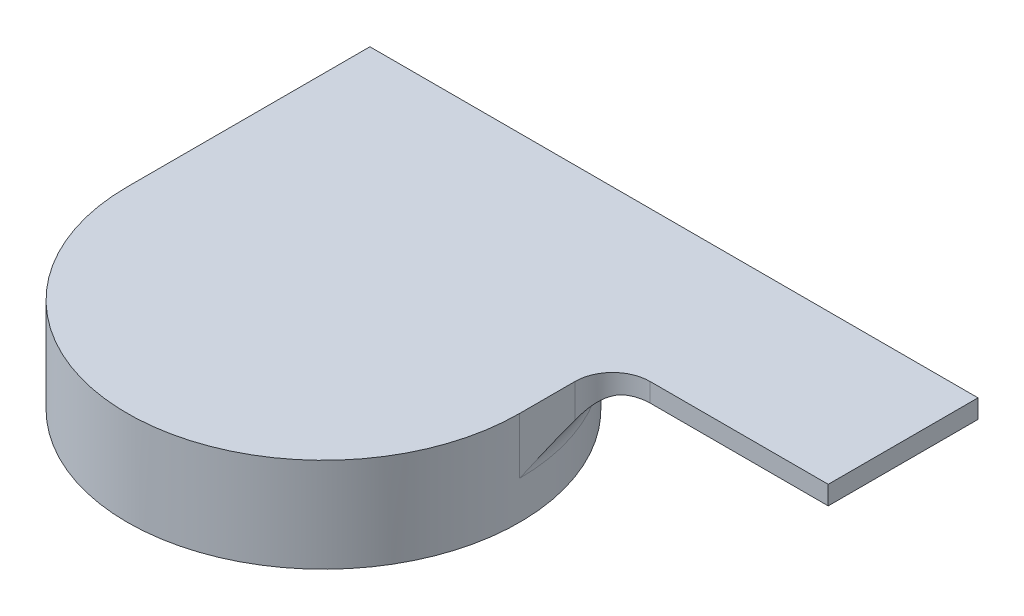
ISO-10303-21;
HEADER;
FILE_DESCRIPTION(('STEP AP214'),'2;1');
FILE_NAME('part.step','',(''),(''),'','','');
FILE_SCHEMA(('AUTOMOTIVE_DESIGN { 1 0 10303 214 1 1 1 1 }'));
ENDSEC;
DATA;
#1=APPLICATION_CONTEXT('core data for automotive mechanical design processes');
#2=APPLICATION_PROTOCOL_DEFINITION('international standard','automotive_design',2000,#1);
#3=PRODUCT_CONTEXT('',#1,'mechanical');
#4=PRODUCT('Part','Part','',(#3));
#5=PRODUCT_RELATED_PRODUCT_CATEGORY('part','',(#4));
#6=PRODUCT_DEFINITION_FORMATION('','',#4);
#7=PRODUCT_DEFINITION_CONTEXT('part definition',#1,'design');
#8=PRODUCT_DEFINITION('design','',#6,#7);
#9=PRODUCT_DEFINITION_SHAPE('','',#8);
#10=(LENGTH_UNIT() NAMED_UNIT(*) SI_UNIT(.MILLI.,.METRE.));
#11=(NAMED_UNIT(*) PLANE_ANGLE_UNIT() SI_UNIT($,.RADIAN.));
#12=(NAMED_UNIT(*) SI_UNIT($,.STERADIAN.) SOLID_ANGLE_UNIT());
#13=UNCERTAINTY_MEASURE_WITH_UNIT(LENGTH_MEASURE(1.E-05),#10,'distance_accuracy_value','');
#14=(GEOMETRIC_REPRESENTATION_CONTEXT(3) GLOBAL_UNCERTAINTY_ASSIGNED_CONTEXT((#13)) GLOBAL_UNIT_ASSIGNED_CONTEXT((#10,
#11,#12)) REPRESENTATION_CONTEXT('',''));
#15=CARTESIAN_POINT('',(0.,0.,0.));
#16=DIRECTION('',(0.,0.,1.));
#17=DIRECTION('',(1.,0.,0.));
#18=AXIS2_PLACEMENT_3D('',#15,#16,#17);
#19=CARTESIAN_POINT('',(0.,16.002,0.));
#20=DIRECTION('',(0.,-1.,0.));
#21=DIRECTION('',(0.,0.,-1.));
#22=AXIS2_PLACEMENT_3D('',#19,#20,#21);
#23=CYLINDRICAL_SURFACE('',#22,33.274);
#24=DIRECTION('',(0.,1.,0.));
#25=VECTOR('',#24,1.);
#26=CARTESIAN_POINT('',(-33.274,12.827,0.));
#27=LINE('',#26,#25);
#28=CARTESIAN_POINT('',(-33.274,6.477,0.));
#29=VERTEX_POINT('',#28);
#30=CARTESIAN_POINT('',(-33.274,16.002,0.));
#31=VERTEX_POINT('',#30);
#32=EDGE_CURVE('E140',#29,#31,#27,.T.);
#33=ORIENTED_EDGE('',*,*,#32,.F.);
#34=CARTESIAN_POINT('',(0.,6.477,0.));
#35=DIRECTION('',(0.,1.,0.));
#36=DIRECTION('',(0.,0.,1.));
#37=AXIS2_PLACEMENT_3D('',#34,#35,#36);
#38=CIRCLE('',#37,33.274);
#39=CARTESIAN_POINT('',(33.274,6.477,0.));
#40=VERTEX_POINT('',#39);
#41=EDGE_CURVE('E155',#29,#40,#38,.F.);
#42=ORIENTED_EDGE('',*,*,#41,.T.);
#43=DIRECTION('',(0.,1.,0.));
#44=VECTOR('',#43,1.);
#45=CARTESIAN_POINT('',(33.274,12.827,0.));
#46=LINE('',#45,#44);
#47=CARTESIAN_POINT('',(33.274,16.002,0.));
#48=VERTEX_POINT('',#47);
#49=EDGE_CURVE('E117',#40,#48,#46,.T.);
#50=ORIENTED_EDGE('',*,*,#49,.T.);
#51=CARTESIAN_POINT('',(0.,16.002,0.));
#52=DIRECTION('',(0.,1.,0.));
#53=DIRECTION('',(0.,0.,1.));
#54=AXIS2_PLACEMENT_3D('',#51,#52,#53);
#55=CIRCLE('',#54,33.274);
#56=EDGE_CURVE('E149',#31,#48,#55,.T.);
#57=ORIENTED_EDGE('',*,*,#56,.F.);
#58=EDGE_LOOP('',(#33,#42,#50,#57));
#59=FACE_BOUND('',#58,.T.);
#60=CARTESIAN_POINT('',(0.,0.,0.));
#61=DIRECTION('',(0.,1.,0.));
#62=DIRECTION('',(0.,0.,1.));
#63=AXIS2_PLACEMENT_3D('',#60,#61,#62);
#64=CIRCLE('',#63,33.274);
#65=CARTESIAN_POINT('',(0.,0.,33.274));
#66=VERTEX_POINT('',#65);
#67=EDGE_CURVE('E143',#66,#66,#64,.T.);
#68=ORIENTED_EDGE('',*,*,#67,.T.);
#69=EDGE_LOOP('',(#68));
#70=FACE_BOUND('',#69,.T.);
#71=ADVANCED_FACE('F33',(#59,#70),#23,.T.);
#72=CARTESIAN_POINT('',(0.,16.002,0.));
#73=DIRECTION('',(0.,1.,0.));
#74=DIRECTION('',(0.,0.,1.));
#75=AXIS2_PLACEMENT_3D('',#72,#73,#74);
#76=PLANE('',#75);
#77=ORIENTED_EDGE('',*,*,#56,.T.);
#78=DIRECTION('',(0.,0.,-1.));
#79=VECTOR('',#78,1.);
#80=CARTESIAN_POINT('',(33.274,16.002,0.));
#81=LINE('',#80,#79);
#82=CARTESIAN_POINT('',(33.274,16.002,-9.398));
#83=VERTEX_POINT('',#82);
#84=EDGE_CURVE('E130',#48,#83,#81,.T.);
#85=ORIENTED_EDGE('',*,*,#84,.T.);
#86=CARTESIAN_POINT('',(39.624,16.002,-9.398));
#87=DIRECTION('',(0.,1.,0.));
#88=DIRECTION('',(0.,0.,1.));
#89=AXIS2_PLACEMENT_3D('',#86,#87,#88);
#90=CIRCLE('',#89,6.35);
#91=CARTESIAN_POINT('',(39.624,16.002,-15.748));
#92=VERTEX_POINT('',#91);
#93=EDGE_CURVE('E214',#83,#92,#90,.F.);
#94=ORIENTED_EDGE('',*,*,#93,.T.);
#95=DIRECTION('',(1.,0.,0.));
#96=VECTOR('',#95,1.);
#97=CARTESIAN_POINT('',(33.274,16.002,-15.748));
#98=LINE('',#97,#96);
#99=CARTESIAN_POINT('',(69.85,16.002,-15.748));
#100=VERTEX_POINT('',#99);
#101=EDGE_CURVE('E133',#92,#100,#98,.T.);
#102=ORIENTED_EDGE('',*,*,#101,.T.);
#103=DIRECTION('',(0.,0.,-1.));
#104=VECTOR('',#103,1.);
#105=CARTESIAN_POINT('',(69.85,16.002,-41.148));
#106=LINE('',#105,#104);
#107=CARTESIAN_POINT('',(69.85,16.002,-41.148));
#108=VERTEX_POINT('',#107);
#109=EDGE_CURVE('E115',#100,#108,#106,.T.);
#110=ORIENTED_EDGE('',*,*,#109,.T.);
#111=DIRECTION('',(-1.,0.,0.));
#112=VECTOR('',#111,1.);
#113=CARTESIAN_POINT('',(-33.274,16.002,-41.148));
#114=LINE('',#113,#112);
#115=CARTESIAN_POINT('',(-33.274,16.002,-41.148));
#116=VERTEX_POINT('',#115);
#117=EDGE_CURVE('E136',#108,#116,#114,.T.);
#118=ORIENTED_EDGE('',*,*,#117,.T.);
#119=DIRECTION('',(0.,0.,1.));
#120=VECTOR('',#119,1.);
#121=CARTESIAN_POINT('',(-33.274,16.002,0.));
#122=LINE('',#121,#120);
#123=EDGE_CURVE('E109',#116,#31,#122,.T.);
#124=ORIENTED_EDGE('',*,*,#123,.T.);
#125=EDGE_LOOP('',(#77,#85,#94,#102,#110,#118,#124));
#126=FACE_BOUND('',#125,.T.);
#127=ADVANCED_FACE('F192',(#126),#76,.T.);
#128=CARTESIAN_POINT('',(0.,0.,0.));
#129=DIRECTION('',(0.,1.,0.));
#130=DIRECTION('',(0.,0.,1.));
#131=AXIS2_PLACEMENT_3D('',#128,#129,#130);
#132=PLANE('',#131);
#133=ORIENTED_EDGE('',*,*,#67,.F.);
#134=EDGE_LOOP('',(#133));
#135=FACE_BOUND('',#134,.T.);
#136=ADVANCED_FACE('F195',(#135),#132,.F.);
#137=CARTESIAN_POINT('',(0.,12.827,0.));
#138=DIRECTION('',(0.,1.,0.));
#139=DIRECTION('',(0.,0.,1.));
#140=AXIS2_PLACEMENT_3D('',#137,#138,#139);
#141=PLANE('',#140);
#142=DIRECTION('',(1.,0.,0.));
#143=VECTOR('',#142,1.);
#144=CARTESIAN_POINT('',(33.274,12.827,-15.748));
#145=LINE('',#144,#143);
#146=CARTESIAN_POINT('',(39.624,12.827,-15.748));
#147=VERTEX_POINT('',#146);
#148=CARTESIAN_POINT('',(69.85,12.827,-15.748));
#149=VERTEX_POINT('',#148);
#150=EDGE_CURVE('E100',#147,#149,#145,.T.);
#151=ORIENTED_EDGE('',*,*,#150,.F.);
#152=CARTESIAN_POINT('',(39.624,12.827,-9.398));
#153=DIRECTION('',(0.,1.,0.));
#154=DIRECTION('',(0.,0.,1.));
#155=AXIS2_PLACEMENT_3D('',#152,#153,#154);
#156=CIRCLE('',#155,6.35);
#157=CARTESIAN_POINT('',(36.6677575554039,12.827,-15.0178870637023));
#158=VERTEX_POINT('',#157);
#159=EDGE_CURVE('E45',#147,#158,#156,.T.);
#160=ORIENTED_EDGE('',*,*,#159,.T.);
#161=CARTESIAN_POINT('',(0.,12.827,0.));
#162=DIRECTION('',(0.,1.,0.));
#163=DIRECTION('',(0.,0.,1.));
#164=AXIS2_PLACEMENT_3D('',#161,#162,#163);
#165=CIRCLE('',#164,39.624);
#166=CARTESIAN_POINT('',(-33.274,12.827,-21.5151644195437));
#167=VERTEX_POINT('',#166);
#168=EDGE_CURVE('E51',#158,#167,#165,.T.);
#169=ORIENTED_EDGE('',*,*,#168,.T.);
#170=DIRECTION('',(0.,0.,1.));
#171=VECTOR('',#170,1.);
#172=CARTESIAN_POINT('',(-33.274,12.827,0.));
#173=LINE('',#172,#171);
#174=CARTESIAN_POINT('',(-33.274,12.827,-41.148));
#175=VERTEX_POINT('',#174);
#176=EDGE_CURVE('E125',#175,#167,#173,.T.);
#177=ORIENTED_EDGE('',*,*,#176,.F.);
#178=DIRECTION('',(-1.,0.,0.));
#179=VECTOR('',#178,1.);
#180=CARTESIAN_POINT('',(-33.274,12.827,-41.148));
#181=LINE('',#180,#179);
#182=CARTESIAN_POINT('',(69.85,12.827,-41.148));
#183=VERTEX_POINT('',#182);
#184=EDGE_CURVE('E123',#183,#175,#181,.T.);
#185=ORIENTED_EDGE('',*,*,#184,.F.);
#186=DIRECTION('',(0.,0.,-1.));
#187=VECTOR('',#186,1.);
#188=CARTESIAN_POINT('',(69.85,12.827,-41.148));
#189=LINE('',#188,#187);
#190=EDGE_CURVE('E108',#149,#183,#189,.T.);
#191=ORIENTED_EDGE('',*,*,#190,.F.);
#192=EDGE_LOOP('',(#151,#160,#169,#177,#185,#191));
#193=FACE_BOUND('',#192,.T.);
#194=ADVANCED_FACE('F120',(#193),#141,.F.);
#195=CARTESIAN_POINT('',(-33.274,12.827,0.));
#196=DIRECTION('',(-1.,0.,0.));
#197=DIRECTION('',(0.,0.,1.));
#198=AXIS2_PLACEMENT_3D('',#195,#196,#197);
#199=PLANE('',#198);
#200=ORIENTED_EDGE('',*,*,#123,.F.);
#201=DIRECTION('',(0.,1.,0.));
#202=VECTOR('',#201,1.);
#203=CARTESIAN_POINT('',(-33.274,12.827,-41.148));
#204=LINE('',#203,#202);
#205=EDGE_CURVE('E144',#175,#116,#204,.T.);
#206=ORIENTED_EDGE('',*,*,#205,.F.);
#207=ORIENTED_EDGE('',*,*,#176,.T.);
#208=CARTESIAN_POINT('',(-33.274,12.827,-21.5151644195437));
#209=CARTESIAN_POINT('',(-33.274,12.8269965383206,-21.3128395480441));
#210=CARTESIAN_POINT('',(-33.274,12.824149426921,-21.1105305347367));
#211=CARTESIAN_POINT('',(-33.274,12.813081509395,-20.7060780321664));
#212=CARTESIAN_POINT('',(-33.274,12.8048612301874,-20.5039345286188));
#213=CARTESIAN_POINT('',(-33.274,12.7726235237426,-19.8981462048356));
#214=CARTESIAN_POINT('',(-33.274,12.7410284354839,-19.4948901516963));
#215=CARTESIAN_POINT('',(-33.274,12.6599715365119,-18.6913745773575));
#216=CARTESIAN_POINT('',(-33.274,12.6105603458468,-18.2911098134066));
#217=CARTESIAN_POINT('',(-33.274,12.4957872260963,-17.4928362429079));
#218=CARTESIAN_POINT('',(-33.274,12.4304227053888,-17.0948278136621));
#219=CARTESIAN_POINT('',(-33.274,12.2146031851565,-15.9132882842229));
#220=CARTESIAN_POINT('',(-33.274,12.0434609162049,-15.1335067059455));
#221=CARTESIAN_POINT('',(-33.274,11.6569575323403,-13.5845777833042));
#222=CARTESIAN_POINT('',(-33.274,11.4415598860232,-12.8154397883368));
#223=CARTESIAN_POINT('',(-33.274,11.0520510132461,-11.5374371040148));
#224=CARTESIAN_POINT('',(-33.274,10.8874416064445,-11.0256336409714));
#225=CARTESIAN_POINT('',(-33.274,10.5449207871129,-10.0064888526166));
#226=CARTESIAN_POINT('',(-33.274,10.3670088798328,-9.49914769405351));
#227=CARTESIAN_POINT('',(-33.274,9.81683831022568,-7.98331243767083));
#228=CARTESIAN_POINT('',(-33.274,9.42808619703558,-6.98082018187442));
#229=CARTESIAN_POINT('',(-33.274,8.62164040635768,-4.98454850114973));
#230=CARTESIAN_POINT('',(-33.274,8.20386978600365,-3.99080077378213));
#231=CARTESIAN_POINT('',(-33.274,7.35462349949581,-2.00916608349406));
#232=CARTESIAN_POINT('',(-33.274,6.92314705692049,-1.02127945637485));
#233=CARTESIAN_POINT('',(-33.274,6.4867364108287,-0.0222876653168525));
#234=CARTESIAN_POINT('',(-33.274,6.481868204751,-0.0111438322937059));
#235=CARTESIAN_POINT('',(-33.274,6.477,0.));
#236=B_SPLINE_CURVE_WITH_KNOTS('',3,(#208,#209,#210,#211,#212,#213,#214,#215,#216,#217,#218,
#219,#220,#221,#222,#223,#224,#225,#226,#227,#228,#229,#230,#231,#232,#233,#234,#235),
.UNSPECIFIED.,.F.,.F.,(4,2,2,2,2,2,2,2,2,2,2,2,2,4),(0.,0.606927972168669,1.2137964349722,
2.4267740144667,3.63633203008669,4.84608666961027,7.23929525970568,9.63448736199307,
11.2471682841813,12.8599092154738,16.0848055494803,19.3186056672016,22.5525893044123,
22.5890716288992),.UNSPECIFIED.);
#237=EDGE_CURVE('E158',#167,#29,#236,.T.);
#238=ORIENTED_EDGE('',*,*,#237,.T.);
#239=ORIENTED_EDGE('',*,*,#32,.T.);
#240=EDGE_LOOP('',(#200,#206,#207,#238,#239));
#241=FACE_BOUND('',#240,.T.);
#242=ADVANCED_FACE('F174',(#241),#199,.T.);
#243=CARTESIAN_POINT('',(-33.274,12.827,-41.148));
#244=DIRECTION('',(0.,0.,-1.));
#245=DIRECTION('',(-1.,0.,0.));
#246=AXIS2_PLACEMENT_3D('',#243,#244,#245);
#247=PLANE('',#246);
#248=ORIENTED_EDGE('',*,*,#117,.F.);
#249=DIRECTION('',(0.,1.,0.));
#250=VECTOR('',#249,1.);
#251=CARTESIAN_POINT('',(69.85,12.827,-41.148));
#252=LINE('',#251,#250);
#253=EDGE_CURVE('E116',#183,#108,#252,.T.);
#254=ORIENTED_EDGE('',*,*,#253,.F.);
#255=ORIENTED_EDGE('',*,*,#184,.T.);
#256=ORIENTED_EDGE('',*,*,#205,.T.);
#257=EDGE_LOOP('',(#248,#254,#255,#256));
#258=FACE_BOUND('',#257,.T.);
#259=ADVANCED_FACE('F179',(#258),#247,.T.);
#260=CARTESIAN_POINT('',(69.85,12.827,-41.148));
#261=DIRECTION('',(1.,0.,0.));
#262=DIRECTION('',(0.,0.,-1.));
#263=AXIS2_PLACEMENT_3D('',#260,#261,#262);
#264=PLANE('',#263);
#265=ORIENTED_EDGE('',*,*,#109,.F.);
#266=DIRECTION('',(0.,1.,0.));
#267=VECTOR('',#266,1.);
#268=CARTESIAN_POINT('',(69.85,12.827,-15.748));
#269=LINE('',#268,#267);
#270=EDGE_CURVE('E103',#149,#100,#269,.T.);
#271=ORIENTED_EDGE('',*,*,#270,.F.);
#272=ORIENTED_EDGE('',*,*,#190,.T.);
#273=ORIENTED_EDGE('',*,*,#253,.T.);
#274=EDGE_LOOP('',(#265,#271,#272,#273));
#275=FACE_BOUND('',#274,.T.);
#276=ADVANCED_FACE('F113',(#275),#264,.T.);
#277=CARTESIAN_POINT('',(33.274,12.827,-15.748));
#278=DIRECTION('',(0.,0.,1.));
#279=DIRECTION('',(1.,0.,0.));
#280=AXIS2_PLACEMENT_3D('',#277,#278,#279);
#281=PLANE('',#280);
#282=ORIENTED_EDGE('',*,*,#101,.F.);
#283=DIRECTION('',(0.,1.,0.));
#284=VECTOR('',#283,1.);
#285=CARTESIAN_POINT('',(39.624,12.1706673037467,-15.748));
#286=LINE('',#285,#284);
#287=EDGE_CURVE('E59',#92,#147,#286,.F.);
#288=ORIENTED_EDGE('',*,*,#287,.T.);
#289=ORIENTED_EDGE('',*,*,#150,.T.);
#290=ORIENTED_EDGE('',*,*,#270,.T.);
#291=EDGE_LOOP('',(#282,#288,#289,#290));
#292=FACE_BOUND('',#291,.T.);
#293=ADVANCED_FACE('F102',(#292),#281,.T.);
#294=CARTESIAN_POINT('',(33.274,12.827,0.));
#295=DIRECTION('',(1.,0.,0.));
#296=DIRECTION('',(0.,0.,-1.));
#297=AXIS2_PLACEMENT_3D('',#294,#295,#296);
#298=PLANE('',#297);
#299=CARTESIAN_POINT('',(33.274,12.1706673037467,-15.748));
#300=CARTESIAN_POINT('',(33.274,12.1153140404355,-15.485979458627));
#301=CARTESIAN_POINT('',(33.274,12.0571099631094,-15.224574941341));
#302=CARTESIAN_POINT('',(33.274,11.9354072419507,-14.7030194907815));
#303=CARTESIAN_POINT('',(33.274,11.8719089734915,-14.4428684700126));
#304=CARTESIAN_POINT('',(33.274,11.6741296870633,-13.6645034610109));
#305=CARTESIAN_POINT('',(33.274,11.5325141912068,-13.1481442606859));
#306=CARTESIAN_POINT('',(33.274,11.2329180504046,-12.1213203578225));
#307=CARTESIAN_POINT('',(33.274,11.0749694354563,-11.6108462212756));
#308=CARTESIAN_POINT('',(33.274,10.7450076873298,-10.5944195595574));
#309=CARTESIAN_POINT('',(33.274,10.5729928978195,-10.088467574686));
#310=CARTESIAN_POINT('',(33.274,10.0405376480277,-8.58012427114889));
#311=CARTESIAN_POINT('',(33.274,9.66267543484246,-7.58389418259669));
#312=CARTESIAN_POINT('',(33.274,8.87640602864826,-5.60323922410806));
#313=CARTESIAN_POINT('',(33.274,8.46798392168063,-4.61882039387053));
#314=CARTESIAN_POINT('',(33.274,7.53969703662096,-2.43287056554385));
#315=CARTESIAN_POINT('',(33.274,7.01568853941516,-1.23311668848449));
#316=CARTESIAN_POINT('',(33.274,6.48673640892137,-0.0222876643021202));
#317=CARTESIAN_POINT('',(33.274,6.48186820282284,-0.0111438312710996));
#318=CARTESIAN_POINT('',(33.274,6.477,0.));
#319=B_SPLINE_CURVE_WITH_KNOTS('',3,(#299,#300,#301,#302,#303,#304,#305,#306,#307,#308,#309,
#310,#311,#312,#313,#314,#315,#316,#317,#318),.UNSPECIFIED.,.F.,.F.,(4,2,2,2,2,2,2,2,2,4),(0.,
0.803372666568424,1.60668842008394,3.21260473462621,4.81542944076542,6.41844315660601,
9.61398082175581,12.8110882868985,16.7385772226782,16.7750595471655),.UNSPECIFIED.);
#320=CARTESIAN_POINT('',(33.274,10.3289507726057,-9.39799999999996));
#321=VERTEX_POINT('',#320);
#322=EDGE_CURVE('E165',#40,#321,#319,.F.);
#323=ORIENTED_EDGE('',*,*,#322,.T.);
#324=DIRECTION('',(0.,1.,0.));
#325=VECTOR('',#324,1.);
#326=CARTESIAN_POINT('',(33.274,16.002,-9.398));
#327=LINE('',#326,#325);
#328=EDGE_CURVE('E213',#321,#83,#327,.T.);
#329=ORIENTED_EDGE('',*,*,#328,.T.);
#330=ORIENTED_EDGE('',*,*,#84,.F.);
#331=ORIENTED_EDGE('',*,*,#49,.F.);
#332=EDGE_LOOP('',(#323,#329,#330,#331));
#333=FACE_BOUND('',#332,.T.);
#334=ADVANCED_FACE('F187',(#333),#298,.T.);
#335=CARTESIAN_POINT('',(0.,6.477,0.));
#336=DIRECTION('',(0.,1.,0.));
#337=DIRECTION('',(0.,0.,1.));
#338=AXIS2_PLACEMENT_3D('',#335,#336,#337);
#339=TOROIDAL_SURFACE('',#338,39.624,6.35);
#340=ORIENTED_EDGE('',*,*,#322,.F.);
#341=ORIENTED_EDGE('',*,*,#41,.F.);
#342=ORIENTED_EDGE('',*,*,#237,.F.);
#343=ORIENTED_EDGE('',*,*,#168,.F.);
#344=CARTESIAN_POINT('',(36.6677575554039,12.827,-15.0178870637023));
#345=CARTESIAN_POINT('',(36.5365638465923,12.8270416333298,-14.9489197302521));
#346=CARTESIAN_POINT('',(36.4078610233214,12.8218599495453,-14.875311695999));
#347=CARTESIAN_POINT('',(36.1565901878148,12.8015819652986,-14.7197704831126));
#348=CARTESIAN_POINT('',(36.0340156681752,12.7864964327813,-14.6378464277487));
#349=CARTESIAN_POINT('',(35.797144681767,12.7471530926799,-14.4673965692218));
#350=CARTESIAN_POINT('',(35.6827734214879,12.7229955789828,-14.3789511569404));
#351=CARTESIAN_POINT('',(35.4615327475671,12.6662280882566,-14.1956042728952));
#352=CARTESIAN_POINT('',(35.3546650006604,12.6336162407906,-14.1007013759084));
#353=CARTESIAN_POINT('',(35.1493828280165,12.5609445878783,-13.9057981124323));
#354=CARTESIAN_POINT('',(35.0509318642669,12.5209196439843,-13.8058231337806));
#355=CARTESIAN_POINT('',(34.8621481483267,12.4342169818604,-13.6011738378656));
#356=CARTESIAN_POINT('',(34.7718190286603,12.3875363107297,-13.4964974489556));
#357=CARTESIAN_POINT('',(34.512615465834,12.2385496330251,-13.1758185276639));
#358=CARTESIAN_POINT('',(34.3561012642306,12.1275124081832,-12.9537201850916));
#359=CARTESIAN_POINT('',(34.1130745719567,11.9215432975428,-12.5588230959998));
#360=CARTESIAN_POINT('',(34.0190185349345,11.8301923160749,-12.3886388698634));
#361=CARTESIAN_POINT('',(33.8477783165619,11.6418900596567,-12.0428038700446));
#362=CARTESIAN_POINT('',(33.7706032076387,11.5449358085162,-11.867150214535));
#363=CARTESIAN_POINT('',(33.6328512068634,11.3486154798805,-11.5110697564454));
#364=CARTESIAN_POINT('',(33.5722566321886,11.24925209581,-11.330648265713));
#365=CARTESIAN_POINT('',(33.4673745423336,11.051471378634,-10.964741769425));
#366=CARTESIAN_POINT('',(33.4230794307866,10.9530536256982,-10.7792591660066));
#367=CARTESIAN_POINT('',(33.3502822452107,10.7594141597639,-10.3986337484312));
#368=CARTESIAN_POINT('',(33.3221134002023,10.6642955926605,-10.2033719678005));
#369=CARTESIAN_POINT('',(33.2935192210881,10.5304086748116,-9.90538131239993));
#370=CARTESIAN_POINT('',(33.2862645919288,10.4872667785147,-9.80525949790782));
#371=CARTESIAN_POINT('',(33.276506292221,10.4048954562032,-9.60308211625857));
#372=CARTESIAN_POINT('',(33.2740074284865,10.3656700265859,-9.50102469780204));
#373=CARTESIAN_POINT('',(33.274,10.3289507726057,-9.39799999999999));
#374=B_SPLINE_CURVE_WITH_KNOTS('',3,(#344,#345,#346,#347,#348,#349,#350,#351,#352,#353,#354,
#355,#356,#357,#358,#359,#360,#361,#362,#363,#364,#365,#366,#367,#368,#369,#370,#371,#372,#373),
.UNSPECIFIED.,.F.,.F.,(4,2,2,2,2,2,2,2,2,2,2,2,2,2,4),(0.,0.444400800414929,0.888319225123237,
1.32746792909273,1.76671387337068,2.20394433897389,2.64136939474179,3.51867663813985,
4.16244924403466,4.80656699134225,5.44999509804109,6.09312295405263,6.74910055972547,
7.07671896521377,7.40466833027887),.UNSPECIFIED.);
#375=EDGE_CURVE('E11',#158,#321,#374,.T.);
#376=ORIENTED_EDGE('',*,*,#375,.T.);
#377=EDGE_LOOP('',(#340,#341,#342,#343,#376));
#378=FACE_BOUND('',#377,.T.);
#379=ADVANCED_FACE('F171',(#378),#339,.F.);
#380=CARTESIAN_POINT('',(39.624,12.827,-9.398));
#381=DIRECTION('',(0.,-1.,0.));
#382=DIRECTION('',(0.,0.,-1.));
#383=AXIS2_PLACEMENT_3D('',#380,#381,#382);
#384=CYLINDRICAL_SURFACE('',#383,6.35);
#385=ORIENTED_EDGE('',*,*,#159,.F.);
#386=ORIENTED_EDGE('',*,*,#287,.F.);
#387=ORIENTED_EDGE('',*,*,#93,.F.);
#388=ORIENTED_EDGE('',*,*,#328,.F.);
#389=ORIENTED_EDGE('',*,*,#375,.F.);
#390=EDGE_LOOP('',(#385,#386,#387,#388,#389));
#391=FACE_BOUND('',#390,.T.);
#392=ADVANCED_FACE('F35',(#391),#384,.F.);
#393=CLOSED_SHELL('',(#71,#127,#136,#194,#242,#259,#276,#293,#334,#379,#392));
#394=MANIFOLD_SOLID_BREP('B2',#393);
#395=ADVANCED_BREP_SHAPE_REPRESENTATION('',(#18,#394),#14);
#396=SHAPE_DEFINITION_REPRESENTATION(#9,#395);
ENDSEC;
END-ISO-10303-21;
